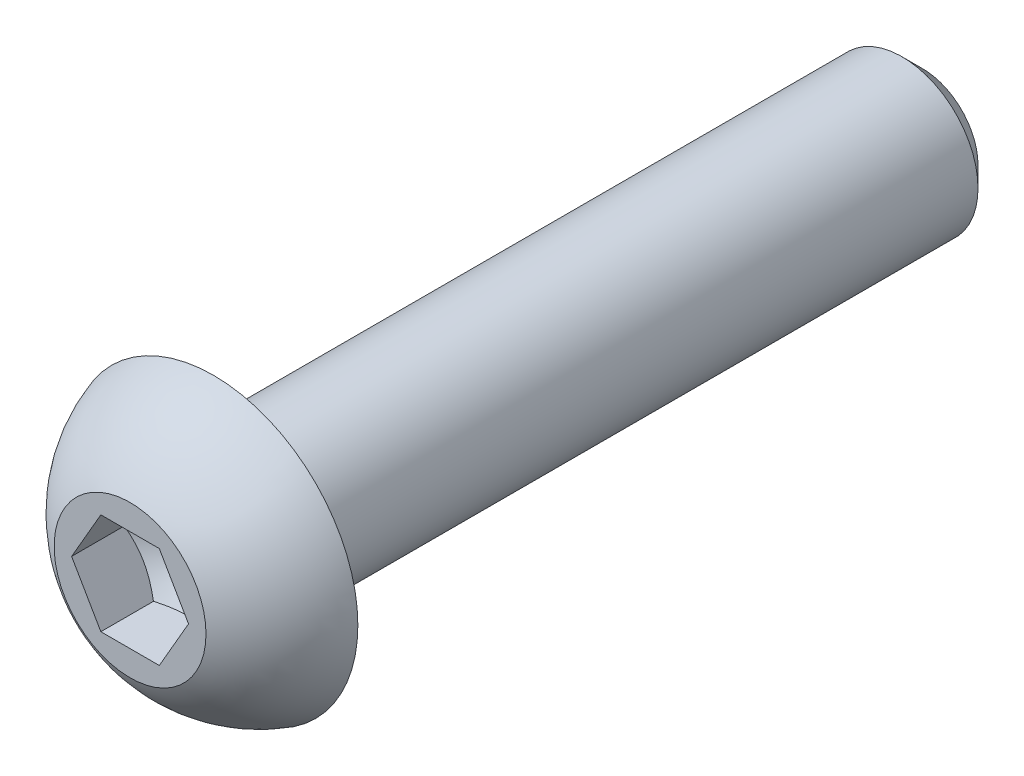
ISO-10303-21;
HEADER;
FILE_DESCRIPTION(('STEP AP214'),'2;1');
FILE_NAME('part.step','',(''),(''),'','','');
FILE_SCHEMA(('AUTOMOTIVE_DESIGN { 1 0 10303 214 1 1 1 1 }'));
ENDSEC;
DATA;
#1=APPLICATION_CONTEXT('core data for automotive mechanical design processes');
#2=APPLICATION_PROTOCOL_DEFINITION('international standard','automotive_design',2000,#1);
#3=PRODUCT_CONTEXT('',#1,'mechanical');
#4=PRODUCT('Part','Part','',(#3));
#5=PRODUCT_RELATED_PRODUCT_CATEGORY('part','',(#4));
#6=PRODUCT_DEFINITION_FORMATION('','',#4);
#7=PRODUCT_DEFINITION_CONTEXT('part definition',#1,'design');
#8=PRODUCT_DEFINITION('design','',#6,#7);
#9=PRODUCT_DEFINITION_SHAPE('','',#8);
#10=(LENGTH_UNIT() NAMED_UNIT(*) SI_UNIT(.MILLI.,.METRE.));
#11=(NAMED_UNIT(*) PLANE_ANGLE_UNIT() SI_UNIT($,.RADIAN.));
#12=(NAMED_UNIT(*) SI_UNIT($,.STERADIAN.) SOLID_ANGLE_UNIT());
#13=UNCERTAINTY_MEASURE_WITH_UNIT(LENGTH_MEASURE(1.E-05),#10,'distance_accuracy_value','');
#14=(GEOMETRIC_REPRESENTATION_CONTEXT(3) GLOBAL_UNCERTAINTY_ASSIGNED_CONTEXT((#13)) GLOBAL_UNIT_ASSIGNED_CONTEXT((#10,
#11,#12)) REPRESENTATION_CONTEXT('',''));
#15=CARTESIAN_POINT('',(0.,0.,0.));
#16=DIRECTION('',(0.,0.,1.));
#17=DIRECTION('',(1.,0.,0.));
#18=AXIS2_PLACEMENT_3D('',#15,#16,#17);
#19=CARTESIAN_POINT('',(0.,0.,-12.));
#20=DIRECTION('',(0.,0.,1.));
#21=DIRECTION('',(1.,0.,0.));
#22=AXIS2_PLACEMENT_3D('',#19,#20,#21);
#23=CYLINDRICAL_SURFACE('',#22,1.5);
#24=CARTESIAN_POINT('',(0.,0.,-13.6));
#25=DIRECTION('',(0.,0.,1.));
#26=DIRECTION('',(1.,0.,0.));
#27=AXIS2_PLACEMENT_3D('',#24,#25,#26);
#28=CIRCLE('',#27,1.5);
#29=CARTESIAN_POINT('',(1.5,0.,-13.6));
#30=VERTEX_POINT('',#29);
#31=EDGE_CURVE('E45',#30,#30,#28,.T.);
#32=ORIENTED_EDGE('',*,*,#31,.T.);
#33=EDGE_LOOP('',(#32));
#34=FACE_BOUND('',#33,.T.);
#35=CARTESIAN_POINT('',(0.,0.,0.));
#36=DIRECTION('',(0.,0.,1.));
#37=DIRECTION('',(1.,0.,0.));
#38=AXIS2_PLACEMENT_3D('',#35,#36,#37);
#39=CIRCLE('',#38,1.5);
#40=CARTESIAN_POINT('',(1.5,0.,0.));
#41=VERTEX_POINT('',#40);
#42=EDGE_CURVE('E145',#41,#41,#39,.T.);
#43=ORIENTED_EDGE('',*,*,#42,.F.);
#44=EDGE_LOOP('',(#43));
#45=FACE_BOUND('',#44,.T.);
#46=ADVANCED_FACE('F37',(#34,#45),#23,.T.);
#47=CARTESIAN_POINT('',(0.,1.5,1.65));
#48=DIRECTION('',(0.,0.,-1.));
#49=DIRECTION('',(-1.,0.,0.));
#50=AXIS2_PLACEMENT_3D('',#47,#48,#49);
#51=PLANE('',#50);
#52=CARTESIAN_POINT('',(0.,0.,1.65));
#53=DIRECTION('',(0.,0.,1.));
#54=DIRECTION('',(1.,0.,0.));
#55=AXIS2_PLACEMENT_3D('',#52,#53,#54);
#56=CIRCLE('',#55,1.5);
#57=CARTESIAN_POINT('',(1.5,0.,1.65));
#58=VERTEX_POINT('',#57);
#59=EDGE_CURVE('E137',#58,#58,#56,.T.);
#60=ORIENTED_EDGE('',*,*,#59,.T.);
#61=EDGE_LOOP('',(#60));
#62=FACE_BOUND('',#61,.T.);
#63=DIRECTION('',(0.5,-0.866025403784439,0.));
#64=VECTOR('',#63,1.);
#65=CARTESIAN_POINT('',(0.57735,0.999999533749892,1.65));
#66=LINE('',#65,#64);
#67=CARTESIAN_POINT('',(0.57735,0.999999533749892,1.65));
#68=VERTEX_POINT('',#67);
#69=CARTESIAN_POINT('',(1.1547,0.,1.65));
#70=VERTEX_POINT('',#69);
#71=EDGE_CURVE('E52',#68,#70,#66,.T.);
#72=ORIENTED_EDGE('',*,*,#71,.T.);
#73=DIRECTION('',(-0.5,-0.866025403784439,0.));
#74=VECTOR('',#73,1.);
#75=CARTESIAN_POINT('',(1.1547,0.,1.65));
#76=LINE('',#75,#74);
#77=CARTESIAN_POINT('',(0.57735,-0.999999533749891,1.65));
#78=VERTEX_POINT('',#77);
#79=EDGE_CURVE('E201',#70,#78,#76,.T.);
#80=ORIENTED_EDGE('',*,*,#79,.T.);
#81=DIRECTION('',(-1.,0.,0.));
#82=VECTOR('',#81,1.);
#83=CARTESIAN_POINT('',(0.57735,-0.999999533749891,1.65));
#84=LINE('',#83,#82);
#85=CARTESIAN_POINT('',(-0.57735,-0.999999533749892,1.65));
#86=VERTEX_POINT('',#85);
#87=EDGE_CURVE('E260',#78,#86,#84,.T.);
#88=ORIENTED_EDGE('',*,*,#87,.T.);
#89=DIRECTION('',(-0.5,0.866025403784439,0.));
#90=VECTOR('',#89,1.);
#91=CARTESIAN_POINT('',(-0.57735,-0.999999533749892,1.65));
#92=LINE('',#91,#90);
#93=CARTESIAN_POINT('',(-1.1547,0.,1.65));
#94=VERTEX_POINT('',#93);
#95=EDGE_CURVE('E255',#86,#94,#92,.T.);
#96=ORIENTED_EDGE('',*,*,#95,.T.);
#97=DIRECTION('',(0.5,0.866025403784439,0.));
#98=VECTOR('',#97,1.);
#99=CARTESIAN_POINT('',(-1.1547,0.,1.65));
#100=LINE('',#99,#98);
#101=CARTESIAN_POINT('',(-0.57735,0.999999533749891,1.65));
#102=VERTEX_POINT('',#101);
#103=EDGE_CURVE('E123',#94,#102,#100,.T.);
#104=ORIENTED_EDGE('',*,*,#103,.T.);
#105=DIRECTION('',(1.,0.,0.));
#106=VECTOR('',#105,1.);
#107=CARTESIAN_POINT('',(-0.57735,0.999999533749891,1.65));
#108=LINE('',#107,#106);
#109=EDGE_CURVE('E115',#102,#68,#108,.T.);
#110=ORIENTED_EDGE('',*,*,#109,.T.);
#111=EDGE_LOOP('',(#72,#80,#88,#96,#104,#110));
#112=FACE_BOUND('',#111,.T.);
#113=ADVANCED_FACE('F159',(#62,#112),#51,.F.);
#114=CARTESIAN_POINT('',(0.,1.5,0.));
#115=DIRECTION('',(0.,0.,1.));
#116=DIRECTION('',(1.,0.,0.));
#117=AXIS2_PLACEMENT_3D('',#114,#115,#116);
#118=PLANE('',#117);
#119=CARTESIAN_POINT('',(0.,0.,0.));
#120=DIRECTION('',(0.,0.,1.));
#121=DIRECTION('',(1.,0.,0.));
#122=AXIS2_PLACEMENT_3D('',#119,#120,#121);
#123=CIRCLE('',#122,2.85);
#124=CARTESIAN_POINT('',(2.85,0.,0.));
#125=VERTEX_POINT('',#124);
#126=EDGE_CURVE('E141',#125,#125,#123,.T.);
#127=ORIENTED_EDGE('',*,*,#126,.F.);
#128=EDGE_LOOP('',(#127));
#129=FACE_BOUND('',#128,.T.);
#130=ORIENTED_EDGE('',*,*,#42,.T.);
#131=EDGE_LOOP('',(#130));
#132=FACE_BOUND('',#131,.T.);
#133=ADVANCED_FACE('F164',(#129,#132),#118,.F.);
#134=CARTESIAN_POINT('',(0.,0.,-0.848743432909576));
#135=DIRECTION('',(0.,0.,1.));
#136=DIRECTION('',(1.,0.,0.));
#137=AXIS2_PLACEMENT_3D('',#134,#135,#136);
#138=DEGENERATE_TOROIDAL_SURFACE('',#137,0.129313581999411,2.85,.T.);
#139=ORIENTED_EDGE('',*,*,#59,.F.);
#140=EDGE_LOOP('',(#139));
#141=FACE_BOUND('',#140,.T.);
#142=ORIENTED_EDGE('',*,*,#126,.T.);
#143=EDGE_LOOP('',(#142));
#144=FACE_BOUND('',#143,.T.);
#145=ADVANCED_FACE('F171',(#141,#144),#138,.T.);
#146=CARTESIAN_POINT('',(0.,0.,-14.));
#147=DIRECTION('',(0.,0.,1.));
#148=DIRECTION('',(1.,0.,0.));
#149=AXIS2_PLACEMENT_3D('',#146,#147,#148);
#150=PLANE('',#149);
#151=CARTESIAN_POINT('',(0.,0.,-14.));
#152=DIRECTION('',(0.,0.,1.));
#153=DIRECTION('',(1.,0.,0.));
#154=AXIS2_PLACEMENT_3D('',#151,#152,#153);
#155=CIRCLE('',#154,1.10000000000001);
#156=CARTESIAN_POINT('',(1.10000000000001,0.,-14.));
#157=VERTEX_POINT('',#156);
#158=EDGE_CURVE('E12',#157,#157,#155,.F.);
#159=ORIENTED_EDGE('',*,*,#158,.T.);
#160=EDGE_LOOP('',(#159));
#161=FACE_BOUND('',#160,.T.);
#162=ADVANCED_FACE('F169',(#161),#150,.F.);
#163=CARTESIAN_POINT('',(0.57735,0.999999533749892,-0.0566663558332609));
#164=DIRECTION('',(-0.866025403784439,-0.5,0.));
#165=DIRECTION('',(-0.5,0.866025403784439,0.));
#166=AXIS2_PLACEMENT_3D('',#163,#164,#165);
#167=PLANE('',#166);
#168=DIRECTION('',(0.,0.,1.));
#169=VECTOR('',#168,1.);
#170=CARTESIAN_POINT('',(1.1547,0.,-0.0566663558332609));
#171=LINE('',#170,#169);
#172=CARTESIAN_POINT('',(1.1547,0.,0.61));
#173=VERTEX_POINT('',#172);
#174=EDGE_CURVE('E135',#173,#70,#171,.T.);
#175=ORIENTED_EDGE('',*,*,#174,.T.);
#176=ORIENTED_EDGE('',*,*,#71,.F.);
#177=DIRECTION('',(0.,0.,1.));
#178=VECTOR('',#177,1.);
#179=CARTESIAN_POINT('',(0.57735,0.999999533749892,-0.0566663558332609));
#180=LINE('',#179,#178);
#181=CARTESIAN_POINT('',(0.57735,0.999999533749892,0.61));
#182=VERTEX_POINT('',#181);
#183=EDGE_CURVE('E108',#182,#68,#180,.T.);
#184=ORIENTED_EDGE('',*,*,#183,.F.);
#185=CARTESIAN_POINT('',(1.15470115470054,-2.E-06,0.610000666667667));
#186=CARTESIAN_POINT('',(1.12933009927234,0.0439419570432811,0.595348391305477));
#187=CARTESIAN_POINT('',(1.10374004129754,0.088265237624272,0.582022905343535));
#188=CARTESIAN_POINT('',(1.05211684902319,0.17767922949234,0.558763650624438));
#189=CARTESIAN_POINT('',(1.02608279776624,0.22277152899623,0.548838109245026));
#190=CARTESIAN_POINT('',(0.974337322784001,0.312397320727257,0.533388262242827));
#191=CARTESIAN_POINT('',(0.948633858612371,0.356917026603046,0.527761117781435));
#192=CARTESIAN_POINT('',(0.897106047785878,0.446165812957328,0.521044692486152));
#193=CARTESIAN_POINT('',(0.871281888296731,0.490894569255292,0.519949848585148));
#194=CARTESIAN_POINT('',(0.823032064442525,0.574465715627026,0.522233105011519));
#195=CARTESIAN_POINT('',(0.800599160429648,0.613320645138646,0.525050590143895));
#196=CARTESIAN_POINT('',(0.755879495715112,0.690777376521668,0.533978623797277));
#197=CARTESIAN_POINT('',(0.733592889575673,0.729378910683452,0.540092219241172));
#198=CARTESIAN_POINT('',(0.688781095362013,0.806995215039833,0.555375050219149));
#199=CARTESIAN_POINT('',(0.666261576071427,0.846000166613155,0.564609039560296));
#200=CARTESIAN_POINT('',(0.621558322302024,0.923428473405406,0.585566301407699));
#201=CARTESIAN_POINT('',(0.599374015548132,0.961852819833839,0.597284652833824));
#202=CARTESIAN_POINT('',(0.577348845299461,1.00000153374989,0.610000666667667));
#203=B_SPLINE_CURVE_WITH_KNOTS('',3,(#185,#186,#187,#188,#189,#190,#191,#192,#193,#194,#195,
#196,#197,#198,#199,#200,#201,#202),.UNSPECIFIED.,.F.,.F.,(4,2,2,2,2,2,2,2,4),(0.,
0.158508089994533,0.317397081098293,0.47235404642363,0.627120756921707,0.761855162972551,
0.896714331530992,1.0345640617321,1.17214324556804),.UNSPECIFIED.);
#204=EDGE_CURVE('E100',#173,#182,#203,.T.);
#205=ORIENTED_EDGE('',*,*,#204,.F.);
#206=EDGE_LOOP('',(#175,#176,#184,#205));
#207=FACE_BOUND('',#206,.T.);
#208=ADVANCED_FACE('F109',(#207),#167,.T.);
#209=CARTESIAN_POINT('',(1.1547,0.,-0.0566663558332609));
#210=DIRECTION('',(-0.866025403784439,0.5,0.));
#211=DIRECTION('',(0.5,0.866025403784439,0.));
#212=AXIS2_PLACEMENT_3D('',#209,#210,#211);
#213=PLANE('',#212);
#214=DIRECTION('',(0.,0.,1.));
#215=VECTOR('',#214,1.);
#216=CARTESIAN_POINT('',(0.57735,-0.999999533749891,-0.0566663558332609));
#217=LINE('',#216,#215);
#218=CARTESIAN_POINT('',(0.57735,-0.999999533749891,0.61));
#219=VERTEX_POINT('',#218);
#220=EDGE_CURVE('E132',#219,#78,#217,.T.);
#221=ORIENTED_EDGE('',*,*,#220,.T.);
#222=ORIENTED_EDGE('',*,*,#79,.F.);
#223=ORIENTED_EDGE('',*,*,#174,.F.);
#224=CARTESIAN_POINT('',(0.577348845299462,-1.00000153374989,0.610000666667667));
#225=CARTESIAN_POINT('',(0.602719900727658,-0.956057576706609,0.595348391305477));
#226=CARTESIAN_POINT('',(0.628309958702461,-0.911734296125618,0.582022905343535));
#227=CARTESIAN_POINT('',(0.679933150976809,-0.82232030425755,0.558763650624437));
#228=CARTESIAN_POINT('',(0.705967202233759,-0.77722800475366,0.548838109245026));
#229=CARTESIAN_POINT('',(0.757712677216,-0.687602213022634,0.533388262242827));
#230=CARTESIAN_POINT('',(0.78341614138763,-0.643082507146845,0.527761117781435));
#231=CARTESIAN_POINT('',(0.834943952214122,-0.553833720792562,0.521044692486152));
#232=CARTESIAN_POINT('',(0.860768111703269,-0.509104964494598,0.519949848585149));
#233=CARTESIAN_POINT('',(0.909017935557475,-0.425533818122865,0.52223310501152));
#234=CARTESIAN_POINT('',(0.931450839570352,-0.386678888611245,0.525050590143896));
#235=CARTESIAN_POINT('',(0.976170504284889,-0.309222157228223,0.533978623797277));
#236=CARTESIAN_POINT('',(0.998457110424327,-0.27062062306644,0.540092219241172));
#237=CARTESIAN_POINT('',(1.04326890463799,-0.193004318710059,0.55537505021915));
#238=CARTESIAN_POINT('',(1.06578842392857,-0.153999367136736,0.564609039560297));
#239=CARTESIAN_POINT('',(1.11049167769798,-0.0765710603444853,0.585566301407699));
#240=CARTESIAN_POINT('',(1.13267598445187,-0.0381467139160524,0.597284652833824));
#241=CARTESIAN_POINT('',(1.15470115470054,1.99999999991805E-06,0.610000666667667));
#242=B_SPLINE_CURVE_WITH_KNOTS('',3,(#224,#225,#226,#227,#228,#229,#230,#231,#232,#233,#234,
#235,#236,#237,#238,#239,#240,#241),.UNSPECIFIED.,.F.,.F.,(4,2,2,2,2,2,2,2,4),(0.,
0.158508089994532,0.317397081098292,0.472354046423629,0.627120756921705,0.761855162972549,
0.89671433153099,1.0345640617321,1.17214324556804),.UNSPECIFIED.);
#243=EDGE_CURVE('E104',#219,#173,#242,.T.);
#244=ORIENTED_EDGE('',*,*,#243,.F.);
#245=EDGE_LOOP('',(#221,#222,#223,#244));
#246=FACE_BOUND('',#245,.T.);
#247=ADVANCED_FACE('F177',(#246),#213,.T.);
#248=CARTESIAN_POINT('',(0.57735,-0.999999533749891,-0.0566663558332609));
#249=DIRECTION('',(0.,1.,0.));
#250=DIRECTION('',(1.,0.,0.));
#251=AXIS2_PLACEMENT_3D('',#248,#249,#250);
#252=PLANE('',#251);
#253=DIRECTION('',(0.,0.,1.));
#254=VECTOR('',#253,1.);
#255=CARTESIAN_POINT('',(-0.57735,-0.999999533749892,-0.0566663558332609));
#256=LINE('',#255,#254);
#257=CARTESIAN_POINT('',(-0.57735,-0.999999533749891,0.61));
#258=VERTEX_POINT('',#257);
#259=EDGE_CURVE('E129',#258,#86,#256,.T.);
#260=ORIENTED_EDGE('',*,*,#259,.T.);
#261=ORIENTED_EDGE('',*,*,#87,.F.);
#262=ORIENTED_EDGE('',*,*,#220,.F.);
#263=CARTESIAN_POINT('',(-1.49514442485991,-0.999999533749892,0.981835115629296));
#264=CARTESIAN_POINT('',(-1.45196058536606,-0.999999533749892,0.961114857654625));
#265=CARTESIAN_POINT('',(-1.40867216909359,-0.999999533749891,0.940613519073185));
#266=CARTESIAN_POINT('',(-1.32182886600433,-0.999999533749891,0.90016329969704));
#267=CARTESIAN_POINT('',(-1.2782739329316,-0.999999533749891,0.880214518325867));
#268=CARTESIAN_POINT('',(-1.14662287013031,-0.999999533749891,0.821145058952465));
#269=CARTESIAN_POINT('',(-1.05805675536899,-0.999999533749892,0.783052448903674));
#270=CARTESIAN_POINT('',(-0.876832601569534,-0.999999533749891,0.710245776691501));
#271=CARTESIAN_POINT('',(-0.784128092285833,-0.999999533749891,0.675645811890966));
#272=CARTESIAN_POINT('',(-0.596331471486308,-0.999999533749891,0.614073472768483));
#273=CARTESIAN_POINT('',(-0.501246273385447,-0.999999533749892,0.587081295872101));
#274=CARTESIAN_POINT('',(-0.356699820153757,-0.999999533749892,0.555775795318476));
#275=CARTESIAN_POINT('',(-0.308244019411516,-0.999999533749891,0.546875127970593));
#276=CARTESIAN_POINT('',(-0.210788772252078,-0.999999533749891,0.532742467757011));
#277=CARTESIAN_POINT('',(-0.161789362800289,-0.999999533749891,0.527510226972721));
#278=CARTESIAN_POINT('',(-0.0641060187969574,-0.999999533749891,0.521199022373477));
#279=CARTESIAN_POINT('',(-0.0154253386130913,-0.999999533749891,0.520071046937628));
#280=CARTESIAN_POINT('',(0.0818553185508148,-0.999999533749891,0.521933019381436));
#281=CARTESIAN_POINT('',(0.130455290347174,-0.999999533749891,0.524923222242145));
#282=CARTESIAN_POINT('',(0.250369475163949,-0.999999533749891,0.537118355954957));
#283=CARTESIAN_POINT('',(0.321451773511317,-0.999999533749891,0.54860859031067));
#284=CARTESIAN_POINT('',(0.462228831139482,-0.999999533749891,0.578240334123231));
#285=CARTESIAN_POINT('',(0.531921810918687,-0.999999533749891,0.596389859966797));
#286=CARTESIAN_POINT('',(0.671415426701005,-0.999999533749891,0.637869712973035));
#287=CARTESIAN_POINT('',(0.741183391837659,-0.999999533749891,0.661307147245493));
#288=CARTESIAN_POINT('',(0.879437913589633,-0.999999533749891,0.711564442476161));
#289=CARTESIAN_POINT('',(0.947924910374635,-0.999999533749891,0.738383116098254));
#290=CARTESIAN_POINT('',(1.12214344819038,-0.999999533749891,0.810053334026309));
#291=CARTESIAN_POINT('',(1.22718281828392,-0.999999533749891,0.856571151467413));
#292=CARTESIAN_POINT('',(1.43575436261154,-0.999999533749891,0.952874570096031));
#293=CARTESIAN_POINT('',(1.53928614185372,-0.999999533749891,1.00266100949593));
#294=CARTESIAN_POINT('',(1.74545816034081,-0.999999533749891,1.10433218680171));
#295=CARTESIAN_POINT('',(1.84809723800398,-0.999999533749891,1.15621927083694));
#296=CARTESIAN_POINT('',(2.05268820074271,-0.999999533749891,1.26133213897693));
#297=CARTESIAN_POINT('',(2.15464006298767,-0.999999533749891,1.31455796728207));
#298=CARTESIAN_POINT('',(2.34844987211841,-0.999999533749891,1.41685880508855));
#299=CARTESIAN_POINT('',(2.4403516275912,-0.999999533749891,1.46585099769028));
#300=CARTESIAN_POINT('',(2.62385949655876,-0.999999533749891,1.56439337097659));
#301=CARTESIAN_POINT('',(2.71546559895035,-0.999999533749891,1.61394357231047));
#302=CARTESIAN_POINT('',(2.89821733508573,-0.999999533749891,1.71333569467085));
#303=CARTESIAN_POINT('',(2.98936354739567,-0.99999953374989,1.76317655314389));
#304=CARTESIAN_POINT('',(3.17147169543988,-0.99999953374989,1.86318266354378));
#305=CARTESIAN_POINT('',(3.26243364056806,-0.999999533749891,1.91334789835804));
#306=CARTESIAN_POINT('',(3.35332938008973,-0.999999533749891,1.96363205437524));
#307=B_SPLINE_CURVE_WITH_KNOTS('',3,(#263,#264,#265,#266,#267,#268,#269,#270,#271,#272,#273,
#274,#275,#276,#277,#278,#279,#280,#281,#282,#283,#284,#285,#286,#287,#288,#289,#290,#291,#292,
#293,#294,#295,#296,#297,#298,#299,#300,#301,#302,#303,#304,#305,#306),.UNSPECIFIED.,.F.,.F.,(4,
2,2,2,2,2,2,2,2,2,2,2,2,2,2,2,2,2,2,2,2,4),(0.,0.143690272658494,0.287406234227527,
0.576560055393514,0.873259077741899,1.16917852539457,1.31686277501978,1.46453704292645,
1.6104419422712,1.75635587586723,1.9719244208457,2.1877533209983,2.40842488718949,
2.62901917835835,2.97354524236226,3.31816000509865,3.66317088870179,4.0081931782759,
4.32062550425272,4.63306943012528,4.94471865214482,5.25635156499875),.UNSPECIFIED.);
#308=EDGE_CURVE('E229',#258,#219,#307,.T.);
#309=ORIENTED_EDGE('',*,*,#308,.F.);
#310=EDGE_LOOP('',(#260,#261,#262,#309));
#311=FACE_BOUND('',#310,.T.);
#312=ADVANCED_FACE('F235',(#311),#252,.T.);
#313=CARTESIAN_POINT('',(-0.57735,-0.999999533749892,-0.0566663558332609));
#314=DIRECTION('',(0.866025403784439,0.5,0.));
#315=DIRECTION('',(0.5,-0.866025403784439,0.));
#316=AXIS2_PLACEMENT_3D('',#313,#314,#315);
#317=PLANE('',#316);
#318=DIRECTION('',(0.,0.,1.));
#319=VECTOR('',#318,1.);
#320=CARTESIAN_POINT('',(-1.1547,0.,-0.0566663558332609));
#321=LINE('',#320,#319);
#322=CARTESIAN_POINT('',(-1.1547,0.,0.61));
#323=VERTEX_POINT('',#322);
#324=EDGE_CURVE('E120',#323,#94,#321,.T.);
#325=ORIENTED_EDGE('',*,*,#324,.T.);
#326=ORIENTED_EDGE('',*,*,#95,.F.);
#327=ORIENTED_EDGE('',*,*,#259,.F.);
#328=CARTESIAN_POINT('',(-1.15470115470054,1.99999999967975E-06,0.610000666667667));
#329=CARTESIAN_POINT('',(-1.12933009927234,-0.0439419570432812,0.595348391305477));
#330=CARTESIAN_POINT('',(-1.10374004129754,-0.0882652376242721,0.582022905343535));
#331=CARTESIAN_POINT('',(-1.05211684902319,-0.17767922949234,0.558763650624438));
#332=CARTESIAN_POINT('',(-1.02608279776624,-0.22277152899623,0.548838109245026));
#333=CARTESIAN_POINT('',(-0.974337322784001,-0.312397320727257,0.533388262242827));
#334=CARTESIAN_POINT('',(-0.948633858612371,-0.356917026603045,0.527761117781435));
#335=CARTESIAN_POINT('',(-0.897106047785879,-0.446165812957328,0.521044692486152));
#336=CARTESIAN_POINT('',(-0.871281888296732,-0.490894569255293,0.519949848585149));
#337=CARTESIAN_POINT('',(-0.823032064442526,-0.574465715627026,0.52223310501152));
#338=CARTESIAN_POINT('',(-0.800599160429648,-0.613320645138646,0.525050590143896));
#339=CARTESIAN_POINT('',(-0.755879495715112,-0.690777376521668,0.533978623797277));
#340=CARTESIAN_POINT('',(-0.733592889575673,-0.729378910683452,0.540092219241172));
#341=CARTESIAN_POINT('',(-0.688781095362013,-0.806995215039832,0.555375050219149));
#342=CARTESIAN_POINT('',(-0.666261576071427,-0.846000166613155,0.564609039560297));
#343=CARTESIAN_POINT('',(-0.621558322302024,-0.923428473405406,0.585566301407699));
#344=CARTESIAN_POINT('',(-0.599374015548132,-0.961852819833839,0.597284652833824));
#345=CARTESIAN_POINT('',(-0.577348845299461,-1.00000153374989,0.610000666667667));
#346=B_SPLINE_CURVE_WITH_KNOTS('',3,(#328,#329,#330,#331,#332,#333,#334,#335,#336,#337,#338,
#339,#340,#341,#342,#343,#344,#345),.UNSPECIFIED.,.F.,.F.,(4,2,2,2,2,2,2,2,4),(0.,
0.158508089994533,0.317397081098293,0.472354046423629,0.627120756921706,0.76185516297255,
0.896714331530991,1.0345640617321,1.17214324556804),.UNSPECIFIED.);
#347=EDGE_CURVE('E223',#323,#258,#346,.T.);
#348=ORIENTED_EDGE('',*,*,#347,.F.);
#349=EDGE_LOOP('',(#325,#326,#327,#348));
#350=FACE_BOUND('',#349,.T.);
#351=ADVANCED_FACE('F238',(#350),#317,.T.);
#352=CARTESIAN_POINT('',(-1.1547,0.,-0.0566663558332609));
#353=DIRECTION('',(0.866025403784439,-0.5,0.));
#354=DIRECTION('',(-0.5,-0.866025403784439,0.));
#355=AXIS2_PLACEMENT_3D('',#352,#353,#354);
#356=PLANE('',#355);
#357=DIRECTION('',(0.,0.,1.));
#358=VECTOR('',#357,1.);
#359=CARTESIAN_POINT('',(-0.57735,0.999999533749891,-0.0566663558332609));
#360=LINE('',#359,#358);
#361=CARTESIAN_POINT('',(-0.57735,0.999999533749891,0.61));
#362=VERTEX_POINT('',#361);
#363=EDGE_CURVE('E114',#362,#102,#360,.T.);
#364=ORIENTED_EDGE('',*,*,#363,.T.);
#365=ORIENTED_EDGE('',*,*,#103,.F.);
#366=ORIENTED_EDGE('',*,*,#324,.F.);
#367=CARTESIAN_POINT('',(-0.577348845299462,1.00000153374989,0.610000666667667));
#368=CARTESIAN_POINT('',(-0.602719900727658,0.956057576706609,0.595348391305477));
#369=CARTESIAN_POINT('',(-0.628309958702461,0.911734296125618,0.582022905343535));
#370=CARTESIAN_POINT('',(-0.679933150976809,0.82232030425755,0.558763650624437));
#371=CARTESIAN_POINT('',(-0.705967202233759,0.77722800475366,0.548838109245026));
#372=CARTESIAN_POINT('',(-0.757712677216,0.687602213022634,0.533388262242827));
#373=CARTESIAN_POINT('',(-0.78341614138763,0.643082507146845,0.527761117781435));
#374=CARTESIAN_POINT('',(-0.834943952214122,0.553833720792562,0.521044692486152));
#375=CARTESIAN_POINT('',(-0.860768111703269,0.509104964494598,0.519949848585149));
#376=CARTESIAN_POINT('',(-0.909017935557475,0.425533818122865,0.52223310501152));
#377=CARTESIAN_POINT('',(-0.931450839570352,0.386678888611245,0.525050590143896));
#378=CARTESIAN_POINT('',(-0.976170504284889,0.309222157228223,0.533978623797277));
#379=CARTESIAN_POINT('',(-0.998457110424327,0.270620623066439,0.540092219241172));
#380=CARTESIAN_POINT('',(-1.04326890463799,0.193004318710059,0.555375050219149));
#381=CARTESIAN_POINT('',(-1.06578842392857,0.153999367136736,0.564609039560296));
#382=CARTESIAN_POINT('',(-1.11049167769798,0.0765710603444851,0.585566301407699));
#383=CARTESIAN_POINT('',(-1.13267598445187,0.0381467139160521,0.597284652833824));
#384=CARTESIAN_POINT('',(-1.15470115470054,-2.00000000016392E-06,0.610000666667667));
#385=B_SPLINE_CURVE_WITH_KNOTS('',3,(#367,#368,#369,#370,#371,#372,#373,#374,#375,#376,#377,
#378,#379,#380,#381,#382,#383,#384),.UNSPECIFIED.,.F.,.F.,(4,2,2,2,2,2,2,2,4),(0.,
0.158508089994532,0.317397081098292,0.472354046423628,0.627120756921705,0.761855162972549,
0.89671433153099,1.0345640617321,1.17214324556804),.UNSPECIFIED.);
#386=EDGE_CURVE('E60',#362,#323,#385,.T.);
#387=ORIENTED_EDGE('',*,*,#386,.F.);
#388=EDGE_LOOP('',(#364,#365,#366,#387));
#389=FACE_BOUND('',#388,.T.);
#390=ADVANCED_FACE('F242',(#389),#356,.T.);
#391=CARTESIAN_POINT('',(-0.57735,0.999999533749891,-0.0566663558332609));
#392=DIRECTION('',(0.,-1.,0.));
#393=DIRECTION('',(-1.,0.,0.));
#394=AXIS2_PLACEMENT_3D('',#391,#392,#393);
#395=PLANE('',#394);
#396=ORIENTED_EDGE('',*,*,#183,.T.);
#397=ORIENTED_EDGE('',*,*,#109,.F.);
#398=ORIENTED_EDGE('',*,*,#363,.F.);
#399=CARTESIAN_POINT('',(-1.49514442485992,0.999999533749891,0.981835115629296));
#400=CARTESIAN_POINT('',(-1.45196058536606,0.999999533749891,0.961114857654626));
#401=CARTESIAN_POINT('',(-1.40867216909359,0.999999533749891,0.940613519073186));
#402=CARTESIAN_POINT('',(-1.32182886600434,0.999999533749891,0.900163299697041));
#403=CARTESIAN_POINT('',(-1.2782739329316,0.999999533749891,0.880214518325867));
#404=CARTESIAN_POINT('',(-1.14662287013032,0.999999533749891,0.821145058952465));
#405=CARTESIAN_POINT('',(-1.05805675536899,0.999999533749891,0.783052448903675));
#406=CARTESIAN_POINT('',(-0.876832601569536,0.999999533749891,0.710245776691501));
#407=CARTESIAN_POINT('',(-0.784128092285834,0.999999533749891,0.675645811890966));
#408=CARTESIAN_POINT('',(-0.596331471486309,0.999999533749891,0.614073472768483));
#409=CARTESIAN_POINT('',(-0.501246273385448,0.999999533749891,0.587081295872103));
#410=CARTESIAN_POINT('',(-0.356699820153758,0.999999533749891,0.555775795318476));
#411=CARTESIAN_POINT('',(-0.308244019411517,0.999999533749891,0.546875127970593));
#412=CARTESIAN_POINT('',(-0.210788772252078,0.999999533749891,0.532742467757011));
#413=CARTESIAN_POINT('',(-0.161789362800289,0.999999533749891,0.527510226972721));
#414=CARTESIAN_POINT('',(-0.0641060187969579,0.999999533749891,0.521199022373477));
#415=CARTESIAN_POINT('',(-0.015425338613092,0.999999533749891,0.520071046937629));
#416=CARTESIAN_POINT('',(0.0818553185508139,0.999999533749891,0.521933019381436));
#417=CARTESIAN_POINT('',(0.130455290347173,0.999999533749892,0.524923222242145));
#418=CARTESIAN_POINT('',(0.250369475163948,0.999999533749892,0.537118355954957));
#419=CARTESIAN_POINT('',(0.321451773511316,0.999999533749892,0.54860859031067));
#420=CARTESIAN_POINT('',(0.462228831139481,0.999999533749891,0.578240334123231));
#421=CARTESIAN_POINT('',(0.531921810918686,0.999999533749892,0.596389859966797));
#422=CARTESIAN_POINT('',(0.671415426701005,0.999999533749892,0.637869712973035));
#423=CARTESIAN_POINT('',(0.741183391837658,0.999999533749892,0.661307147245493));
#424=CARTESIAN_POINT('',(0.879437913589632,0.999999533749892,0.711564442476161));
#425=CARTESIAN_POINT('',(0.947924910374634,0.999999533749892,0.738383116098254));
#426=CARTESIAN_POINT('',(1.12214344819038,0.999999533749892,0.810053334026309));
#427=CARTESIAN_POINT('',(1.22718281828392,0.999999533749892,0.856571151467414));
#428=CARTESIAN_POINT('',(1.43575436261153,0.999999533749892,0.952874570096032));
#429=CARTESIAN_POINT('',(1.53928614185372,0.999999533749892,1.00266100949593));
#430=CARTESIAN_POINT('',(1.74545816034081,0.999999533749892,1.10433218680171));
#431=CARTESIAN_POINT('',(1.84809723800398,0.999999533749892,1.15621927083694));
#432=CARTESIAN_POINT('',(2.05268820074271,0.999999533749892,1.26133213897694));
#433=CARTESIAN_POINT('',(2.15464006298767,0.999999533749892,1.31455796728207));
#434=CARTESIAN_POINT('',(2.34844987211841,0.999999533749892,1.41685880508855));
#435=CARTESIAN_POINT('',(2.4403516275912,0.999999533749892,1.46585099769028));
#436=CARTESIAN_POINT('',(2.62385949655876,0.999999533749892,1.56439337097659));
#437=CARTESIAN_POINT('',(2.71546559895035,0.999999533749893,1.61394357231047));
#438=CARTESIAN_POINT('',(2.89821733508573,0.999999533749893,1.71333569467085));
#439=CARTESIAN_POINT('',(2.98936354739567,0.999999533749893,1.76317655314389));
#440=CARTESIAN_POINT('',(3.17147169543988,0.999999533749893,1.86318266354378));
#441=CARTESIAN_POINT('',(3.26243364056805,0.999999533749893,1.91334789835804));
#442=CARTESIAN_POINT('',(3.35332938008972,0.999999533749893,1.96363205437524));
#443=B_SPLINE_CURVE_WITH_KNOTS('',3,(#399,#400,#401,#402,#403,#404,#405,#406,#407,#408,#409,
#410,#411,#412,#413,#414,#415,#416,#417,#418,#419,#420,#421,#422,#423,#424,#425,#426,#427,#428,
#429,#430,#431,#432,#433,#434,#435,#436,#437,#438,#439,#440,#441,#442),.UNSPECIFIED.,.F.,.F.,(4,
2,2,2,2,2,2,2,2,2,2,2,2,2,2,2,2,2,2,2,2,4),(0.,0.143690272658494,0.287406234227528,
0.576560055393515,0.8732590777419,1.16917852539457,1.31686277501978,1.46453704292645,
1.6104419422712,1.75635587586723,1.9719244208457,2.1877533209983,2.40842488718949,
2.62901917835836,2.97354524236226,3.31816000509865,3.66317088870179,4.0081931782759,
4.32062550425272,4.63306943012528,4.94471865214482,5.25635156499875),.UNSPECIFIED.);
#444=EDGE_CURVE('E101',#182,#362,#443,.F.);
#445=ORIENTED_EDGE('',*,*,#444,.F.);
#446=EDGE_LOOP('',(#396,#397,#398,#445));
#447=FACE_BOUND('',#446,.T.);
#448=ADVANCED_FACE('F96',(#447),#395,.T.);
#449=CARTESIAN_POINT('',(0.,0.,-0.0566663558332609));
#450=DIRECTION('',(0.,0.,1.));
#451=DIRECTION('',(1.,0.,0.));
#452=AXIS2_PLACEMENT_3D('',#449,#450,#451);
#453=CONICAL_SURFACE('',#452,0.,1.0471975511966);
#454=CARTESIAN_POINT('',(0.,0.,-0.0566663558332609));
#455=VERTEX_POINT('',#454);
#456=VERTEX_LOOP('',#455);
#457=FACE_BOUND('',#456,.T.);
#458=ORIENTED_EDGE('',*,*,#204,.T.);
#459=ORIENTED_EDGE('',*,*,#444,.T.);
#460=ORIENTED_EDGE('',*,*,#386,.T.);
#461=ORIENTED_EDGE('',*,*,#347,.T.);
#462=ORIENTED_EDGE('',*,*,#308,.T.);
#463=ORIENTED_EDGE('',*,*,#243,.T.);
#464=EDGE_LOOP('',(#458,#459,#460,#461,#462,#463));
#465=FACE_BOUND('',#464,.T.);
#466=ADVANCED_FACE('F93',(#457,#465),#453,.F.);
#467=CARTESIAN_POINT('',(0.,0.,-13.6));
#468=DIRECTION('',(0.,0.,1.));
#469=DIRECTION('',(1.,0.,0.));
#470=AXIS2_PLACEMENT_3D('',#467,#468,#469);
#471=CONICAL_SURFACE('',#470,1.5,0.785398163397449);
#472=ORIENTED_EDGE('',*,*,#158,.F.);
#473=EDGE_LOOP('',(#472));
#474=FACE_BOUND('',#473,.T.);
#475=ORIENTED_EDGE('',*,*,#31,.F.);
#476=EDGE_LOOP('',(#475));
#477=FACE_BOUND('',#476,.T.);
#478=ADVANCED_FACE('F39',(#474,#477),#471,.T.);
#479=CLOSED_SHELL('',(#46,#113,#133,#145,#162,#208,#247,#312,#351,#390,#448,#466,#478));
#480=MANIFOLD_SOLID_BREP('B2',#479);
#481=ADVANCED_BREP_SHAPE_REPRESENTATION('',(#18,#480),#14);
#482=SHAPE_DEFINITION_REPRESENTATION(#9,#481);
ENDSEC;
END-ISO-10303-21;
